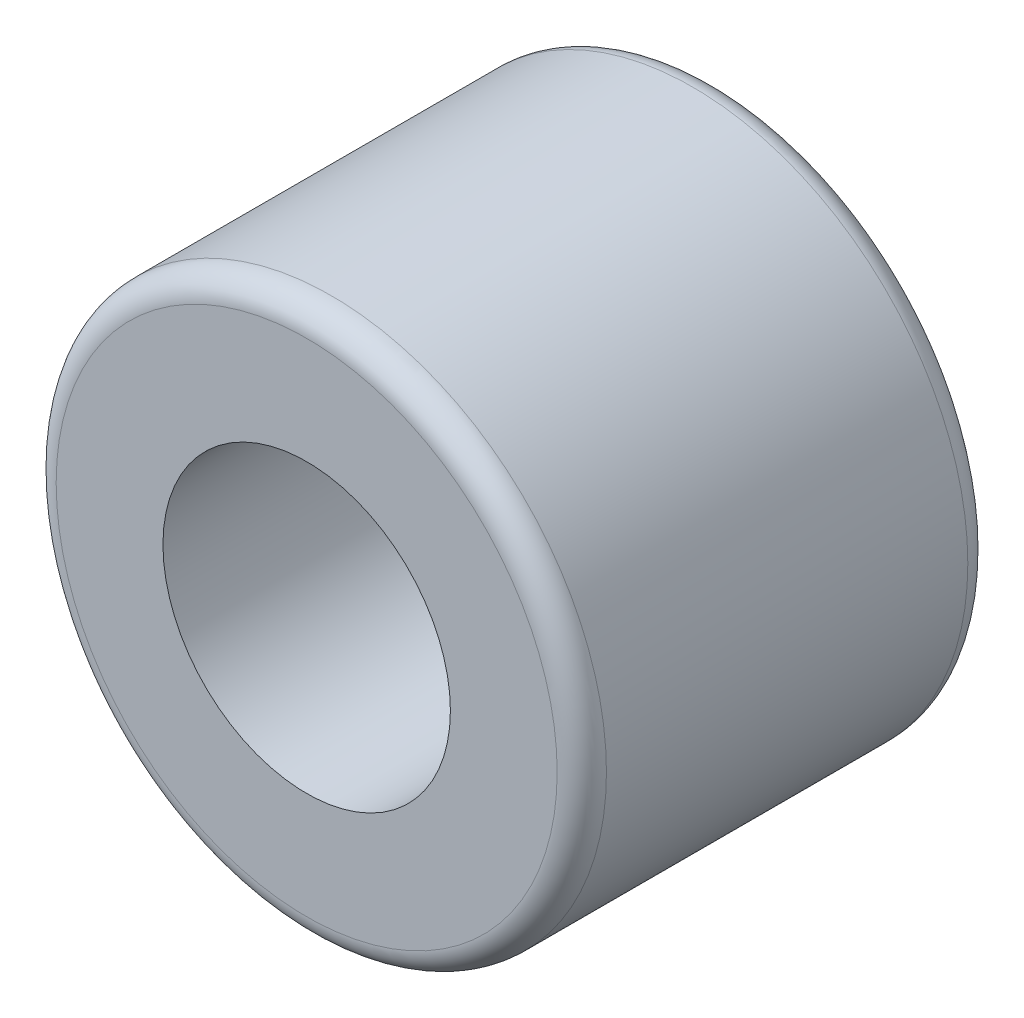
ISO-10303-21;
HEADER;
FILE_DESCRIPTION(('STEP AP214'),'2;1');
FILE_NAME('part.step','',(''),(''),'','','');
FILE_SCHEMA(('AUTOMOTIVE_DESIGN { 1 0 10303 214 1 1 1 1 }'));
ENDSEC;
DATA;
#1=APPLICATION_CONTEXT('core data for automotive mechanical design processes');
#2=APPLICATION_PROTOCOL_DEFINITION('international standard','automotive_design',2000,#1);
#3=PRODUCT_CONTEXT('',#1,'mechanical');
#4=PRODUCT('Part','Part','',(#3));
#5=PRODUCT_RELATED_PRODUCT_CATEGORY('part','',(#4));
#6=PRODUCT_DEFINITION_FORMATION('','',#4);
#7=PRODUCT_DEFINITION_CONTEXT('part definition',#1,'design');
#8=PRODUCT_DEFINITION('design','',#6,#7);
#9=PRODUCT_DEFINITION_SHAPE('','',#8);
#10=(LENGTH_UNIT() NAMED_UNIT(*) SI_UNIT(.MILLI.,.METRE.));
#11=(NAMED_UNIT(*) PLANE_ANGLE_UNIT() SI_UNIT($,.RADIAN.));
#12=(NAMED_UNIT(*) SI_UNIT($,.STERADIAN.) SOLID_ANGLE_UNIT());
#13=UNCERTAINTY_MEASURE_WITH_UNIT(LENGTH_MEASURE(1.E-05),#10,'distance_accuracy_value','');
#14=(GEOMETRIC_REPRESENTATION_CONTEXT(3) GLOBAL_UNCERTAINTY_ASSIGNED_CONTEXT((#13)) GLOBAL_UNIT_ASSIGNED_CONTEXT((#10,
#11,#12)) REPRESENTATION_CONTEXT('',''));
#15=CARTESIAN_POINT('',(0.,0.,0.));
#16=DIRECTION('',(0.,0.,1.));
#17=DIRECTION('',(1.,0.,0.));
#18=AXIS2_PLACEMENT_3D('',#15,#16,#17);
#19=CARTESIAN_POINT('',(0.,0.,12.7));
#20=DIRECTION('',(0.,0.,1.));
#21=DIRECTION('',(1.,0.,0.));
#22=AXIS2_PLACEMENT_3D('',#19,#20,#21);
#23=PLANE('',#22);
#24=CARTESIAN_POINT('',(0.,0.,12.7));
#25=DIRECTION('',(0.,0.,1.));
#26=DIRECTION('',(1.,0.,0.));
#27=AXIS2_PLACEMENT_3D('',#24,#25,#26);
#28=CIRCLE('',#27,7.747);
#29=CARTESIAN_POINT('',(7.747,0.,12.7));
#30=VERTEX_POINT('',#29);
#31=EDGE_CURVE('E10',#30,#30,#28,.T.);
#32=ORIENTED_EDGE('',*,*,#31,.T.);
#33=EDGE_LOOP('',(#32));
#34=FACE_BOUND('',#33,.T.);
#35=CARTESIAN_POINT('',(0.,0.,12.7));
#36=DIRECTION('',(0.,0.,1.));
#37=DIRECTION('',(1.,0.,0.));
#38=AXIS2_PLACEMENT_3D('',#35,#36,#37);
#39=CIRCLE('',#38,4.445);
#40=CARTESIAN_POINT('',(4.445,0.,12.7));
#41=VERTEX_POINT('',#40);
#42=EDGE_CURVE('E65',#41,#41,#39,.T.);
#43=ORIENTED_EDGE('',*,*,#42,.F.);
#44=EDGE_LOOP('',(#43));
#45=FACE_BOUND('',#44,.T.);
#46=ADVANCED_FACE('F41',(#34,#45),#23,.T.);
#47=CARTESIAN_POINT('',(0.,0.,0.));
#48=DIRECTION('',(0.,0.,1.));
#49=DIRECTION('',(1.,0.,0.));
#50=AXIS2_PLACEMENT_3D('',#47,#48,#49);
#51=PLANE('',#50);
#52=CARTESIAN_POINT('',(0.,0.,0.));
#53=DIRECTION('',(0.,0.,1.));
#54=DIRECTION('',(1.,0.,0.));
#55=AXIS2_PLACEMENT_3D('',#52,#53,#54);
#56=CIRCLE('',#55,7.747);
#57=CARTESIAN_POINT('',(7.747,0.,0.));
#58=VERTEX_POINT('',#57);
#59=EDGE_CURVE('E49',#58,#58,#56,.F.);
#60=ORIENTED_EDGE('',*,*,#59,.T.);
#61=EDGE_LOOP('',(#60));
#62=FACE_BOUND('',#61,.T.);
#63=CARTESIAN_POINT('',(0.,0.,0.));
#64=DIRECTION('',(0.,0.,1.));
#65=DIRECTION('',(1.,0.,0.));
#66=AXIS2_PLACEMENT_3D('',#63,#64,#65);
#67=CIRCLE('',#66,4.445);
#68=CARTESIAN_POINT('',(4.445,0.,0.));
#69=VERTEX_POINT('',#68);
#70=EDGE_CURVE('E66',#69,#69,#67,.T.);
#71=ORIENTED_EDGE('',*,*,#70,.T.);
#72=EDGE_LOOP('',(#71));
#73=FACE_BOUND('',#72,.T.);
#74=ADVANCED_FACE('F78',(#62,#73),#51,.F.);
#75=CARTESIAN_POINT('',(0.,0.,12.7));
#76=DIRECTION('',(0.,0.,-1.));
#77=DIRECTION('',(-1.,0.,0.));
#78=AXIS2_PLACEMENT_3D('',#75,#76,#77);
#79=CYLINDRICAL_SURFACE('',#78,8.509);
#80=CARTESIAN_POINT('',(0.,0.,0.762000000000001));
#81=DIRECTION('',(0.,0.,1.));
#82=DIRECTION('',(1.,0.,0.));
#83=AXIS2_PLACEMENT_3D('',#80,#81,#82);
#84=CIRCLE('',#83,8.509);
#85=CARTESIAN_POINT('',(8.509,0.,0.762000000000001));
#86=VERTEX_POINT('',#85);
#87=EDGE_CURVE('E54',#86,#86,#84,.T.);
#88=ORIENTED_EDGE('',*,*,#87,.T.);
#89=EDGE_LOOP('',(#88));
#90=FACE_BOUND('',#89,.T.);
#91=CARTESIAN_POINT('',(0.,0.,11.938));
#92=DIRECTION('',(0.,0.,1.));
#93=DIRECTION('',(1.,0.,0.));
#94=AXIS2_PLACEMENT_3D('',#91,#92,#93);
#95=CIRCLE('',#94,8.509);
#96=CARTESIAN_POINT('',(8.509,0.,11.938));
#97=VERTEX_POINT('',#96);
#98=EDGE_CURVE('E59',#97,#97,#95,.F.);
#99=ORIENTED_EDGE('',*,*,#98,.T.);
#100=EDGE_LOOP('',(#99));
#101=FACE_BOUND('',#100,.T.);
#102=ADVANCED_FACE('F83',(#90,#101),#79,.T.);
#103=CARTESIAN_POINT('',(0.,0.,12.7));
#104=DIRECTION('',(0.,0.,-1.));
#105=DIRECTION('',(-1.,0.,0.));
#106=AXIS2_PLACEMENT_3D('',#103,#104,#105);
#107=CYLINDRICAL_SURFACE('',#106,4.445);
#108=ORIENTED_EDGE('',*,*,#42,.T.);
#109=EDGE_LOOP('',(#108));
#110=FACE_BOUND('',#109,.T.);
#111=ORIENTED_EDGE('',*,*,#70,.F.);
#112=EDGE_LOOP('',(#111));
#113=FACE_BOUND('',#112,.T.);
#114=ADVANCED_FACE('F74',(#110,#113),#107,.F.);
#115=CARTESIAN_POINT('',(0.,0.,0.762000000000001));
#116=DIRECTION('',(0.,0.,1.));
#117=DIRECTION('',(1.,0.,0.));
#118=AXIS2_PLACEMENT_3D('',#115,#116,#117);
#119=TOROIDAL_SURFACE('',#118,7.747,0.762);
#120=ORIENTED_EDGE('',*,*,#59,.F.);
#121=EDGE_LOOP('',(#120));
#122=FACE_BOUND('',#121,.T.);
#123=ORIENTED_EDGE('',*,*,#87,.F.);
#124=EDGE_LOOP('',(#123));
#125=FACE_BOUND('',#124,.T.);
#126=ADVANCED_FACE('F89',(#122,#125),#119,.T.);
#127=CARTESIAN_POINT('',(0.,0.,11.938));
#128=DIRECTION('',(0.,0.,1.));
#129=DIRECTION('',(1.,0.,0.));
#130=AXIS2_PLACEMENT_3D('',#127,#128,#129);
#131=TOROIDAL_SURFACE('',#130,7.747,0.762);
#132=ORIENTED_EDGE('',*,*,#98,.F.);
#133=EDGE_LOOP('',(#132));
#134=FACE_BOUND('',#133,.T.);
#135=ORIENTED_EDGE('',*,*,#31,.F.);
#136=EDGE_LOOP('',(#135));
#137=FACE_BOUND('',#136,.T.);
#138=ADVANCED_FACE('F43',(#134,#137),#131,.T.);
#139=CLOSED_SHELL('',(#46,#74,#102,#114,#126,#138));
#140=MANIFOLD_SOLID_BREP('B2',#139);
#141=ADVANCED_BREP_SHAPE_REPRESENTATION('',(#18,#140),#14);
#142=SHAPE_DEFINITION_REPRESENTATION(#9,#141);
ENDSEC;
END-ISO-10303-21;
